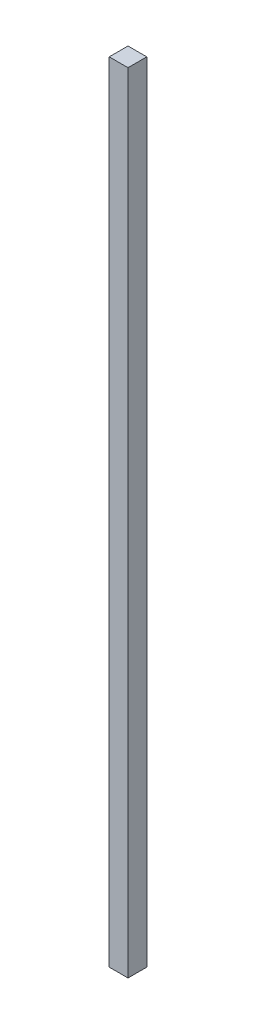
ISO-10303-21;
HEADER;
FILE_DESCRIPTION(('STEP AP214'),'2;1');
FILE_NAME('part.step','',(''),(''),'','','');
FILE_SCHEMA(('AUTOMOTIVE_DESIGN { 1 0 10303 214 1 1 1 1 }'));
ENDSEC;
DATA;
#1=APPLICATION_CONTEXT('core data for automotive mechanical design processes');
#2=APPLICATION_PROTOCOL_DEFINITION('international standard','automotive_design',2000,#1);
#3=PRODUCT_CONTEXT('',#1,'mechanical');
#4=PRODUCT('Part','Part','',(#3));
#5=PRODUCT_RELATED_PRODUCT_CATEGORY('part','',(#4));
#6=PRODUCT_DEFINITION_FORMATION('','',#4);
#7=PRODUCT_DEFINITION_CONTEXT('part definition',#1,'design');
#8=PRODUCT_DEFINITION('design','',#6,#7);
#9=PRODUCT_DEFINITION_SHAPE('','',#8);
#10=(LENGTH_UNIT() NAMED_UNIT(*) SI_UNIT(.MILLI.,.METRE.));
#11=(NAMED_UNIT(*) PLANE_ANGLE_UNIT() SI_UNIT($,.RADIAN.));
#12=(NAMED_UNIT(*) SI_UNIT($,.STERADIAN.) SOLID_ANGLE_UNIT());
#13=UNCERTAINTY_MEASURE_WITH_UNIT(LENGTH_MEASURE(1.E-05),#10,'distance_accuracy_value','');
#14=(GEOMETRIC_REPRESENTATION_CONTEXT(3) GLOBAL_UNCERTAINTY_ASSIGNED_CONTEXT((#13)) GLOBAL_UNIT_ASSIGNED_CONTEXT((#10,
#11,#12)) REPRESENTATION_CONTEXT('',''));
#15=CARTESIAN_POINT('',(0.,0.,0.));
#16=DIRECTION('',(0.,0.,1.));
#17=DIRECTION('',(1.,0.,0.));
#18=AXIS2_PLACEMENT_3D('',#15,#16,#17);
#19=CARTESIAN_POINT('',(620.,120.,-800.));
#20=DIRECTION('',(-1.,0.,0.));
#21=DIRECTION('',(0.,0.,1.));
#22=AXIS2_PLACEMENT_3D('',#19,#20,#21);
#23=PLANE('',#22);
#24=DIRECTION('',(0.,-1.,0.));
#25=VECTOR('',#24,1.);
#26=CARTESIAN_POINT('',(620.,120.,-760.));
#27=LINE('',#26,#25);
#28=CARTESIAN_POINT('',(620.,1800.,-760.));
#29=VERTEX_POINT('',#28);
#30=CARTESIAN_POINT('',(620.,120.,-760.));
#31=VERTEX_POINT('',#30);
#32=EDGE_CURVE('E103',#29,#31,#27,.T.);
#33=ORIENTED_EDGE('',*,*,#32,.F.);
#34=DIRECTION('',(0.,0.,1.));
#35=VECTOR('',#34,1.);
#36=CARTESIAN_POINT('',(620.,1800.,-800.));
#37=LINE('',#36,#35);
#38=CARTESIAN_POINT('',(620.,1800.,-800.));
#39=VERTEX_POINT('',#38);
#40=EDGE_CURVE('E11',#39,#29,#37,.T.);
#41=ORIENTED_EDGE('',*,*,#40,.F.);
#42=DIRECTION('',(0.,-1.,0.));
#43=VECTOR('',#42,1.);
#44=CARTESIAN_POINT('',(620.,120.,-800.));
#45=LINE('',#44,#43);
#46=CARTESIAN_POINT('',(620.,120.,-800.));
#47=VERTEX_POINT('',#46);
#48=EDGE_CURVE('E97',#39,#47,#45,.T.);
#49=ORIENTED_EDGE('',*,*,#48,.T.);
#50=DIRECTION('',(0.,0.,1.));
#51=VECTOR('',#50,1.);
#52=CARTESIAN_POINT('',(620.,120.,-800.));
#53=LINE('',#52,#51);
#54=EDGE_CURVE('E42',#47,#31,#53,.T.);
#55=ORIENTED_EDGE('',*,*,#54,.T.);
#56=EDGE_LOOP('',(#33,#41,#49,#55));
#57=FACE_BOUND('',#56,.T.);
#58=ADVANCED_FACE('F39',(#57),#23,.T.);
#59=CARTESIAN_POINT('',(620.,1800.,-800.));
#60=DIRECTION('',(0.,1.,0.));
#61=DIRECTION('',(0.,0.,1.));
#62=AXIS2_PLACEMENT_3D('',#59,#60,#61);
#63=PLANE('',#62);
#64=DIRECTION('',(-1.,0.,0.));
#65=VECTOR('',#64,1.);
#66=CARTESIAN_POINT('',(620.,1800.,-760.));
#67=LINE('',#66,#65);
#68=CARTESIAN_POINT('',(660.,1800.,-760.));
#69=VERTEX_POINT('',#68);
#70=EDGE_CURVE('E99',#69,#29,#67,.T.);
#71=ORIENTED_EDGE('',*,*,#70,.F.);
#72=DIRECTION('',(0.,0.,1.));
#73=VECTOR('',#72,1.);
#74=CARTESIAN_POINT('',(660.,1800.,-800.));
#75=LINE('',#74,#73);
#76=CARTESIAN_POINT('',(660.,1800.,-800.));
#77=VERTEX_POINT('',#76);
#78=EDGE_CURVE('E48',#77,#69,#75,.T.);
#79=ORIENTED_EDGE('',*,*,#78,.F.);
#80=DIRECTION('',(-1.,0.,0.));
#81=VECTOR('',#80,1.);
#82=CARTESIAN_POINT('',(620.,1800.,-800.));
#83=LINE('',#82,#81);
#84=EDGE_CURVE('E94',#77,#39,#83,.T.);
#85=ORIENTED_EDGE('',*,*,#84,.T.);
#86=ORIENTED_EDGE('',*,*,#40,.T.);
#87=EDGE_LOOP('',(#71,#79,#85,#86));
#88=FACE_BOUND('',#87,.T.);
#89=ADVANCED_FACE('F113',(#88),#63,.T.);
#90=CARTESIAN_POINT('',(660.,120.,-800.));
#91=DIRECTION('',(1.,0.,0.));
#92=DIRECTION('',(0.,0.,-1.));
#93=AXIS2_PLACEMENT_3D('',#90,#91,#92);
#94=PLANE('',#93);
#95=DIRECTION('',(0.,1.,0.));
#96=VECTOR('',#95,1.);
#97=CARTESIAN_POINT('',(660.,120.,-760.));
#98=LINE('',#97,#96);
#99=CARTESIAN_POINT('',(660.,120.,-760.));
#100=VERTEX_POINT('',#99);
#101=EDGE_CURVE('E89',#100,#69,#98,.T.);
#102=ORIENTED_EDGE('',*,*,#101,.F.);
#103=DIRECTION('',(0.,0.,1.));
#104=VECTOR('',#103,1.);
#105=CARTESIAN_POINT('',(660.,120.,-800.));
#106=LINE('',#105,#104);
#107=CARTESIAN_POINT('',(660.,120.,-800.));
#108=VERTEX_POINT('',#107);
#109=EDGE_CURVE('E84',#108,#100,#106,.T.);
#110=ORIENTED_EDGE('',*,*,#109,.F.);
#111=DIRECTION('',(0.,1.,0.));
#112=VECTOR('',#111,1.);
#113=CARTESIAN_POINT('',(660.,120.,-800.));
#114=LINE('',#113,#112);
#115=EDGE_CURVE('E87',#108,#77,#114,.T.);
#116=ORIENTED_EDGE('',*,*,#115,.T.);
#117=ORIENTED_EDGE('',*,*,#78,.T.);
#118=EDGE_LOOP('',(#102,#110,#116,#117));
#119=FACE_BOUND('',#118,.T.);
#120=ADVANCED_FACE('F86',(#119),#94,.T.);
#121=CARTESIAN_POINT('',(620.,120.,-800.));
#122=DIRECTION('',(0.,-1.,0.));
#123=DIRECTION('',(0.,0.,-1.));
#124=AXIS2_PLACEMENT_3D('',#121,#122,#123);
#125=PLANE('',#124);
#126=DIRECTION('',(1.,0.,0.));
#127=VECTOR('',#126,1.);
#128=CARTESIAN_POINT('',(620.,120.,-760.));
#129=LINE('',#128,#127);
#130=EDGE_CURVE('E106',#31,#100,#129,.T.);
#131=ORIENTED_EDGE('',*,*,#130,.F.);
#132=ORIENTED_EDGE('',*,*,#54,.F.);
#133=DIRECTION('',(1.,0.,0.));
#134=VECTOR('',#133,1.);
#135=CARTESIAN_POINT('',(620.,120.,-800.));
#136=LINE('',#135,#134);
#137=EDGE_CURVE('E93',#47,#108,#136,.T.);
#138=ORIENTED_EDGE('',*,*,#137,.T.);
#139=ORIENTED_EDGE('',*,*,#109,.T.);
#140=EDGE_LOOP('',(#131,#132,#138,#139));
#141=FACE_BOUND('',#140,.T.);
#142=ADVANCED_FACE('F96',(#141),#125,.T.);
#143=CARTESIAN_POINT('',(0.,0.,-800.));
#144=DIRECTION('',(0.,0.,-1.));
#145=DIRECTION('',(-1.,0.,0.));
#146=AXIS2_PLACEMENT_3D('',#143,#144,#145);
#147=PLANE('',#146);
#148=ORIENTED_EDGE('',*,*,#48,.F.);
#149=ORIENTED_EDGE('',*,*,#84,.F.);
#150=ORIENTED_EDGE('',*,*,#115,.F.);
#151=ORIENTED_EDGE('',*,*,#137,.F.);
#152=EDGE_LOOP('',(#148,#149,#150,#151));
#153=FACE_BOUND('',#152,.T.);
#154=ADVANCED_FACE('F92',(#153),#147,.T.);
#155=CARTESIAN_POINT('',(0.,0.,-760.));
#156=DIRECTION('',(0.,0.,-1.));
#157=DIRECTION('',(-1.,0.,0.));
#158=AXIS2_PLACEMENT_3D('',#155,#156,#157);
#159=PLANE('',#158);
#160=ORIENTED_EDGE('',*,*,#32,.T.);
#161=ORIENTED_EDGE('',*,*,#130,.T.);
#162=ORIENTED_EDGE('',*,*,#101,.T.);
#163=ORIENTED_EDGE('',*,*,#70,.T.);
#164=EDGE_LOOP('',(#160,#161,#162,#163));
#165=FACE_BOUND('',#164,.T.);
#166=ADVANCED_FACE('F112',(#165),#159,.F.);
#167=CLOSED_SHELL('',(#58,#89,#120,#142,#154,#166));
#168=MANIFOLD_SOLID_BREP('B2',#167);
#169=ADVANCED_BREP_SHAPE_REPRESENTATION('',(#18,#168),#14);
#170=SHAPE_DEFINITION_REPRESENTATION(#9,#169);
ENDSEC;
END-ISO-10303-21;
